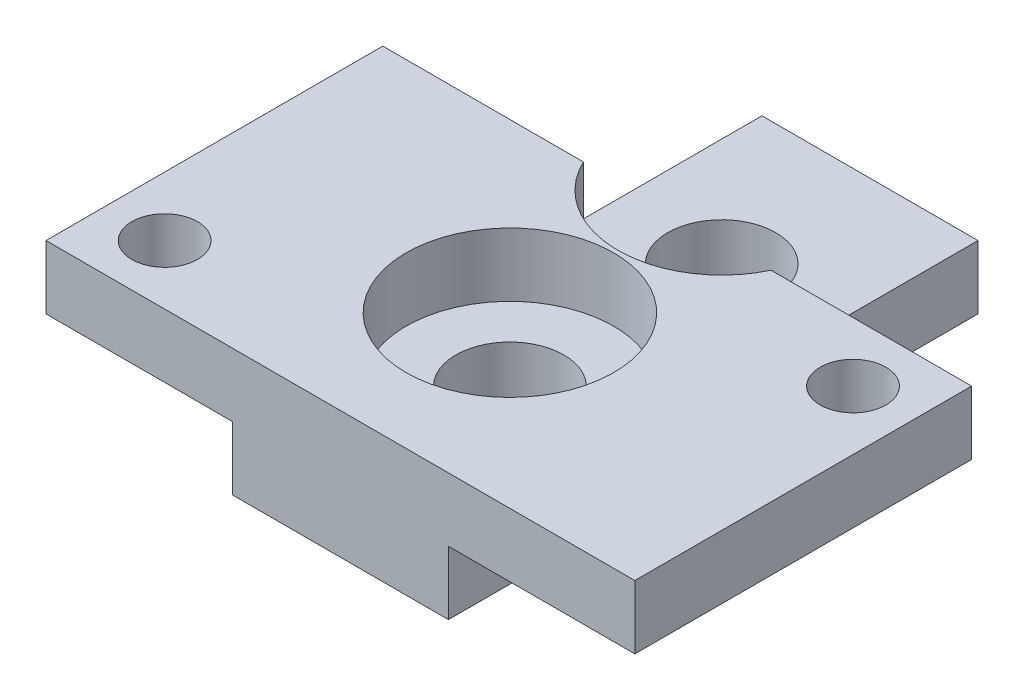
ISO-10303-21;
HEADER;
FILE_DESCRIPTION(('STEP AP214'),'2;1');
FILE_NAME('part.step','',(''),(''),'','','');
FILE_SCHEMA(('AUTOMOTIVE_DESIGN { 1 0 10303 214 1 1 1 1 }'));
ENDSEC;
DATA;
#1=APPLICATION_CONTEXT('core data for automotive mechanical design processes');
#2=APPLICATION_PROTOCOL_DEFINITION('international standard','automotive_design',2000,#1);
#3=PRODUCT_CONTEXT('',#1,'mechanical');
#4=PRODUCT('Part','Part','',(#3));
#5=PRODUCT_RELATED_PRODUCT_CATEGORY('part','',(#4));
#6=PRODUCT_DEFINITION_FORMATION('','',#4);
#7=PRODUCT_DEFINITION_CONTEXT('part definition',#1,'design');
#8=PRODUCT_DEFINITION('design','',#6,#7);
#9=PRODUCT_DEFINITION_SHAPE('','',#8);
#10=(LENGTH_UNIT() NAMED_UNIT(*) SI_UNIT(.MILLI.,.METRE.));
#11=(NAMED_UNIT(*) PLANE_ANGLE_UNIT() SI_UNIT($,.RADIAN.));
#12=(NAMED_UNIT(*) SI_UNIT($,.STERADIAN.) SOLID_ANGLE_UNIT());
#13=UNCERTAINTY_MEASURE_WITH_UNIT(LENGTH_MEASURE(1.E-05),#10,'distance_accuracy_value','');
#14=(GEOMETRIC_REPRESENTATION_CONTEXT(3) GLOBAL_UNCERTAINTY_ASSIGNED_CONTEXT((#13)) GLOBAL_UNIT_ASSIGNED_CONTEXT((#10,
#11,#12)) REPRESENTATION_CONTEXT('',''));
#15=CARTESIAN_POINT('',(0.,0.,0.));
#16=DIRECTION('',(0.,0.,1.));
#17=DIRECTION('',(1.,0.,0.));
#18=AXIS2_PLACEMENT_3D('',#15,#16,#17);
#19=CARTESIAN_POINT('',(0.,3.,-15.9));
#20=DIRECTION('',(0.,0.,1.));
#21=DIRECTION('',(1.,0.,0.));
#22=AXIS2_PLACEMENT_3D('',#19,#20,#21);
#23=PLANE('',#22);
#24=DIRECTION('',(-1.,0.,0.));
#25=VECTOR('',#24,1.);
#26=CARTESIAN_POINT('',(0.,0.,-15.9));
#27=LINE('',#26,#25);
#28=CARTESIAN_POINT('',(19.,0.,-15.9));
#29=VERTEX_POINT('',#28);
#30=CARTESIAN_POINT('',(18.3271887242357,0.,-15.9));
#31=VERTEX_POINT('',#30);
#32=EDGE_CURVE('E147',#29,#31,#27,.T.);
#33=ORIENTED_EDGE('',*,*,#32,.T.);
#34=DIRECTION('',(0.,1.,0.));
#35=VECTOR('',#34,1.);
#36=CARTESIAN_POINT('',(18.3271887242357,0.,-15.9));
#37=LINE('',#36,#35);
#38=CARTESIAN_POINT('',(18.3271887242357,3.,-15.9));
#39=VERTEX_POINT('',#38);
#40=EDGE_CURVE('E128',#31,#39,#37,.T.);
#41=ORIENTED_EDGE('',*,*,#40,.T.);
#42=DIRECTION('',(-1.,0.,0.));
#43=VECTOR('',#42,1.);
#44=CARTESIAN_POINT('',(0.,3.,-15.9));
#45=LINE('',#44,#43);
#46=CARTESIAN_POINT('',(27.8,3.,-15.9));
#47=VERTEX_POINT('',#46);
#48=EDGE_CURVE('E178',#47,#39,#45,.T.);
#49=ORIENTED_EDGE('',*,*,#48,.F.);
#50=DIRECTION('',(0.,-1.,0.));
#51=VECTOR('',#50,1.);
#52=CARTESIAN_POINT('',(27.8,3.,-15.9));
#53=LINE('',#52,#51);
#54=CARTESIAN_POINT('',(27.8,0.,-15.9));
#55=VERTEX_POINT('',#54);
#56=EDGE_CURVE('E198',#47,#55,#53,.T.);
#57=ORIENTED_EDGE('',*,*,#56,.T.);
#58=EDGE_CURVE('E150',#55,#29,#27,.T.);
#59=ORIENTED_EDGE('',*,*,#58,.T.);
#60=EDGE_LOOP('',(#33,#41,#49,#57,#59));
#61=FACE_BOUND('',#60,.T.);
#62=ADVANCED_FACE('F39',(#61),#23,.F.);
#63=CARTESIAN_POINT('',(0.,0.,0.));
#64=DIRECTION('',(0.,-1.,0.));
#65=DIRECTION('',(0.,0.,-1.));
#66=AXIS2_PLACEMENT_3D('',#63,#64,#65);
#67=PLANE('',#66);
#68=DIRECTION('',(0.,0.,-1.));
#69=VECTOR('',#68,1.);
#70=CARTESIAN_POINT('',(8.8,0.,0.));
#71=LINE('',#70,#69);
#72=CARTESIAN_POINT('',(8.8,0.,0.));
#73=VERTEX_POINT('',#72);
#74=CARTESIAN_POINT('',(8.8,0.,-15.9));
#75=VERTEX_POINT('',#74);
#76=EDGE_CURVE('E55',#73,#75,#71,.T.);
#77=ORIENTED_EDGE('',*,*,#76,.F.);
#78=DIRECTION('',(1.,0.,0.));
#79=VECTOR('',#78,1.);
#80=CARTESIAN_POINT('',(0.,0.,0.));
#81=LINE('',#80,#79);
#82=CARTESIAN_POINT('',(0.,0.,0.));
#83=VERTEX_POINT('',#82);
#84=EDGE_CURVE('E189',#83,#73,#81,.T.);
#85=ORIENTED_EDGE('',*,*,#84,.F.);
#86=DIRECTION('',(0.,0.,1.));
#87=VECTOR('',#86,1.);
#88=CARTESIAN_POINT('',(0.,0.,0.));
#89=LINE('',#88,#87);
#90=CARTESIAN_POINT('',(0.,0.,-15.9));
#91=VERTEX_POINT('',#90);
#92=EDGE_CURVE('E183',#91,#83,#89,.T.);
#93=ORIENTED_EDGE('',*,*,#92,.F.);
#94=EDGE_CURVE('E148',#75,#91,#27,.T.);
#95=ORIENTED_EDGE('',*,*,#94,.F.);
#96=EDGE_LOOP('',(#77,#85,#93,#95));
#97=FACE_BOUND('',#96,.T.);
#98=CARTESIAN_POINT('',(2.8,0.,-2.8));
#99=DIRECTION('',(0.,1.,0.));
#100=DIRECTION('',(0.,0.,1.));
#101=AXIS2_PLACEMENT_3D('',#98,#99,#100);
#102=CIRCLE('',#101,1.55);
#103=CARTESIAN_POINT('',(2.8,0.,-1.25));
#104=VERTEX_POINT('',#103);
#105=EDGE_CURVE('E173',#104,#104,#102,.T.);
#106=ORIENTED_EDGE('',*,*,#105,.T.);
#107=EDGE_LOOP('',(#106));
#108=FACE_BOUND('',#107,.T.);
#109=ADVANCED_FACE('F278',(#97,#108),#67,.T.);
#110=CARTESIAN_POINT('',(0.,3.,0.));
#111=DIRECTION('',(0.,-1.,0.));
#112=DIRECTION('',(0.,0.,-1.));
#113=AXIS2_PLACEMENT_3D('',#110,#111,#112);
#114=PLANE('',#113);
#115=CARTESIAN_POINT('',(13.9,3.,-8.));
#116=DIRECTION('',(0.,1.,0.));
#117=DIRECTION('',(0.,0.,1.));
#118=AXIS2_PLACEMENT_3D('',#115,#116,#117);
#119=CIRCLE('',#118,4.9);
#120=CARTESIAN_POINT('',(13.9,3.,-3.1));
#121=VERTEX_POINT('',#120);
#122=EDGE_CURVE('E257',#121,#121,#119,.T.);
#123=ORIENTED_EDGE('',*,*,#122,.F.);
#124=EDGE_LOOP('',(#123));
#125=FACE_BOUND('',#124,.T.);
#126=ORIENTED_EDGE('',*,*,#48,.T.);
#127=CARTESIAN_POINT('',(13.9,3.,-18.));
#128=DIRECTION('',(0.,1.,0.));
#129=DIRECTION('',(0.,0.,1.));
#130=AXIS2_PLACEMENT_3D('',#127,#128,#129);
#131=CIRCLE('',#130,4.9);
#132=CARTESIAN_POINT('',(9.47281127576427,3.,-15.9));
#133=VERTEX_POINT('',#132);
#134=EDGE_CURVE('E133',#133,#39,#131,.T.);
#135=ORIENTED_EDGE('',*,*,#134,.F.);
#136=CARTESIAN_POINT('',(0.,3.,-15.9));
#137=VERTEX_POINT('',#136);
#138=EDGE_CURVE('E138',#133,#137,#45,.T.);
#139=ORIENTED_EDGE('',*,*,#138,.T.);
#140=DIRECTION('',(0.,0.,1.));
#141=VECTOR('',#140,1.);
#142=CARTESIAN_POINT('',(0.,3.,0.));
#143=LINE('',#142,#141);
#144=CARTESIAN_POINT('',(0.,3.,0.));
#145=VERTEX_POINT('',#144);
#146=EDGE_CURVE('E158',#137,#145,#143,.T.);
#147=ORIENTED_EDGE('',*,*,#146,.T.);
#148=DIRECTION('',(1.,0.,0.));
#149=VECTOR('',#148,1.);
#150=CARTESIAN_POINT('',(0.,3.,0.));
#151=LINE('',#150,#149);
#152=CARTESIAN_POINT('',(27.8,3.,0.));
#153=VERTEX_POINT('',#152);
#154=EDGE_CURVE('E164',#145,#153,#151,.T.);
#155=ORIENTED_EDGE('',*,*,#154,.T.);
#156=DIRECTION('',(0.,0.,-1.));
#157=VECTOR('',#156,1.);
#158=CARTESIAN_POINT('',(27.8,3.,0.));
#159=LINE('',#158,#157);
#160=EDGE_CURVE('E170',#153,#47,#159,.T.);
#161=ORIENTED_EDGE('',*,*,#160,.T.);
#162=EDGE_LOOP('',(#126,#135,#139,#147,#155,#161));
#163=FACE_BOUND('',#162,.T.);
#164=CARTESIAN_POINT('',(2.8,3.,-2.8));
#165=DIRECTION('',(0.,1.,0.));
#166=DIRECTION('',(0.,0.,1.));
#167=AXIS2_PLACEMENT_3D('',#164,#165,#166);
#168=CIRCLE('',#167,1.55);
#169=CARTESIAN_POINT('',(2.8,3.,-1.25));
#170=VERTEX_POINT('',#169);
#171=EDGE_CURVE('E188',#170,#170,#168,.T.);
#172=ORIENTED_EDGE('',*,*,#171,.F.);
#173=EDGE_LOOP('',(#172));
#174=FACE_BOUND('',#173,.T.);
#175=CARTESIAN_POINT('',(25.,3.,-13.1));
#176=DIRECTION('',(0.,1.,0.));
#177=DIRECTION('',(0.,0.,1.));
#178=AXIS2_PLACEMENT_3D('',#175,#176,#177);
#179=CIRCLE('',#178,1.55);
#180=CARTESIAN_POINT('',(25.,3.,-11.55));
#181=VERTEX_POINT('',#180);
#182=EDGE_CURVE('E299',#181,#181,#179,.T.);
#183=ORIENTED_EDGE('',*,*,#182,.F.);
#184=EDGE_LOOP('',(#183));
#185=FACE_BOUND('',#184,.T.);
#186=ADVANCED_FACE('F268',(#125,#163,#174,#185),#114,.F.);
#187=DIRECTION('',(0.,0.,1.));
#188=VECTOR('',#187,1.);
#189=CARTESIAN_POINT('',(19.,0.,0.));
#190=LINE('',#189,#188);
#191=CARTESIAN_POINT('',(19.,0.,0.));
#192=VERTEX_POINT('',#191);
#193=EDGE_CURVE('E48',#29,#192,#190,.T.);
#194=ORIENTED_EDGE('',*,*,#193,.F.);
#195=ORIENTED_EDGE('',*,*,#58,.F.);
#196=DIRECTION('',(0.,0.,-1.));
#197=VECTOR('',#196,1.);
#198=CARTESIAN_POINT('',(27.8,0.,0.));
#199=LINE('',#198,#197);
#200=CARTESIAN_POINT('',(27.8,0.,0.));
#201=VERTEX_POINT('',#200);
#202=EDGE_CURVE('E153',#201,#55,#199,.T.);
#203=ORIENTED_EDGE('',*,*,#202,.F.);
#204=EDGE_CURVE('E187',#192,#201,#81,.T.);
#205=ORIENTED_EDGE('',*,*,#204,.F.);
#206=EDGE_LOOP('',(#194,#195,#203,#205));
#207=FACE_BOUND('',#206,.T.);
#208=CARTESIAN_POINT('',(25.,0.,-13.1));
#209=DIRECTION('',(0.,1.,0.));
#210=DIRECTION('',(0.,0.,1.));
#211=AXIS2_PLACEMENT_3D('',#208,#209,#210);
#212=CIRCLE('',#211,1.55);
#213=CARTESIAN_POINT('',(25.,0.,-11.55));
#214=VERTEX_POINT('',#213);
#215=EDGE_CURVE('E298',#214,#214,#212,.T.);
#216=ORIENTED_EDGE('',*,*,#215,.T.);
#217=EDGE_LOOP('',(#216));
#218=FACE_BOUND('',#217,.T.);
#219=ADVANCED_FACE('F205',(#207,#218),#67,.T.);
#220=CARTESIAN_POINT('',(0.,3.,0.));
#221=DIRECTION('',(1.,0.,0.));
#222=DIRECTION('',(0.,0.,-1.));
#223=AXIS2_PLACEMENT_3D('',#220,#221,#222);
#224=PLANE('',#223);
#225=ORIENTED_EDGE('',*,*,#92,.T.);
#226=DIRECTION('',(0.,-1.,0.));
#227=VECTOR('',#226,1.);
#228=CARTESIAN_POINT('',(0.,3.,0.));
#229=LINE('',#228,#227);
#230=EDGE_CURVE('E213',#145,#83,#229,.T.);
#231=ORIENTED_EDGE('',*,*,#230,.F.);
#232=ORIENTED_EDGE('',*,*,#146,.F.);
#233=DIRECTION('',(0.,-1.,0.));
#234=VECTOR('',#233,1.);
#235=CARTESIAN_POINT('',(0.,3.,-15.9));
#236=LINE('',#235,#234);
#237=EDGE_CURVE('E182',#137,#91,#236,.T.);
#238=ORIENTED_EDGE('',*,*,#237,.T.);
#239=EDGE_LOOP('',(#225,#231,#232,#238));
#240=FACE_BOUND('',#239,.T.);
#241=ADVANCED_FACE('F41',(#240),#224,.F.);
#242=CARTESIAN_POINT('',(0.,3.,0.));
#243=DIRECTION('',(0.,0.,-1.));
#244=DIRECTION('',(-1.,0.,0.));
#245=AXIS2_PLACEMENT_3D('',#242,#243,#244);
#246=PLANE('',#245);
#247=ORIENTED_EDGE('',*,*,#84,.T.);
#248=DIRECTION('',(0.,1.,0.));
#249=VECTOR('',#248,1.);
#250=CARTESIAN_POINT('',(8.8,-3.,0.));
#251=LINE('',#250,#249);
#252=CARTESIAN_POINT('',(8.8,-3.,0.));
#253=VERTEX_POINT('',#252);
#254=EDGE_CURVE('E239',#253,#73,#251,.T.);
#255=ORIENTED_EDGE('',*,*,#254,.F.);
#256=DIRECTION('',(-1.,0.,0.));
#257=VECTOR('',#256,1.);
#258=CARTESIAN_POINT('',(8.8,-3.,0.));
#259=LINE('',#258,#257);
#260=CARTESIAN_POINT('',(19.,-3.,0.));
#261=VERTEX_POINT('',#260);
#262=EDGE_CURVE('E236',#261,#253,#259,.T.);
#263=ORIENTED_EDGE('',*,*,#262,.F.);
#264=DIRECTION('',(0.,1.,0.));
#265=VECTOR('',#264,1.);
#266=CARTESIAN_POINT('',(19.,-3.,0.));
#267=LINE('',#266,#265);
#268=EDGE_CURVE('E288',#261,#192,#267,.T.);
#269=ORIENTED_EDGE('',*,*,#268,.T.);
#270=ORIENTED_EDGE('',*,*,#204,.T.);
#271=DIRECTION('',(0.,-1.,0.));
#272=VECTOR('',#271,1.);
#273=CARTESIAN_POINT('',(27.8,3.,0.));
#274=LINE('',#273,#272);
#275=EDGE_CURVE('E201',#153,#201,#274,.T.);
#276=ORIENTED_EDGE('',*,*,#275,.F.);
#277=ORIENTED_EDGE('',*,*,#154,.F.);
#278=ORIENTED_EDGE('',*,*,#230,.T.);
#279=EDGE_LOOP('',(#247,#255,#263,#269,#270,#276,#277,#278));
#280=FACE_BOUND('',#279,.T.);
#281=ADVANCED_FACE('F271',(#280),#246,.F.);
#282=CARTESIAN_POINT('',(27.8,3.,0.));
#283=DIRECTION('',(-1.,0.,0.));
#284=DIRECTION('',(0.,0.,1.));
#285=AXIS2_PLACEMENT_3D('',#282,#283,#284);
#286=PLANE('',#285);
#287=ORIENTED_EDGE('',*,*,#202,.T.);
#288=ORIENTED_EDGE('',*,*,#56,.F.);
#289=ORIENTED_EDGE('',*,*,#160,.F.);
#290=ORIENTED_EDGE('',*,*,#275,.T.);
#291=EDGE_LOOP('',(#287,#288,#289,#290));
#292=FACE_BOUND('',#291,.T.);
#293=ADVANCED_FACE('F196',(#292),#286,.F.);
#294=ORIENTED_EDGE('',*,*,#138,.F.);
#295=DIRECTION('',(0.,1.,0.));
#296=VECTOR('',#295,1.);
#297=CARTESIAN_POINT('',(9.47281127576427,0.,-15.9));
#298=LINE('',#297,#296);
#299=CARTESIAN_POINT('',(9.47281127576427,0.,-15.9));
#300=VERTEX_POINT('',#299);
#301=EDGE_CURVE('E125',#300,#133,#298,.T.);
#302=ORIENTED_EDGE('',*,*,#301,.F.);
#303=EDGE_CURVE('E63',#300,#75,#27,.T.);
#304=ORIENTED_EDGE('',*,*,#303,.T.);
#305=ORIENTED_EDGE('',*,*,#94,.T.);
#306=ORIENTED_EDGE('',*,*,#237,.F.);
#307=EDGE_LOOP('',(#294,#302,#304,#305,#306));
#308=FACE_BOUND('',#307,.T.);
#309=ADVANCED_FACE('F136',(#308),#23,.F.);
#310=CARTESIAN_POINT('',(2.8,3.,-2.8));
#311=DIRECTION('',(0.,-1.,0.));
#312=DIRECTION('',(0.,0.,-1.));
#313=AXIS2_PLACEMENT_3D('',#310,#311,#312);
#314=CYLINDRICAL_SURFACE('',#313,1.55);
#315=ORIENTED_EDGE('',*,*,#171,.T.);
#316=EDGE_LOOP('',(#315));
#317=FACE_BOUND('',#316,.T.);
#318=ORIENTED_EDGE('',*,*,#105,.F.);
#319=EDGE_LOOP('',(#318));
#320=FACE_BOUND('',#319,.T.);
#321=ADVANCED_FACE('F313',(#317,#320),#314,.F.);
#322=CARTESIAN_POINT('',(25.,3.,-13.1));
#323=DIRECTION('',(0.,-1.,0.));
#324=DIRECTION('',(0.,0.,-1.));
#325=AXIS2_PLACEMENT_3D('',#322,#323,#324);
#326=CYLINDRICAL_SURFACE('',#325,1.55);
#327=ORIENTED_EDGE('',*,*,#182,.T.);
#328=EDGE_LOOP('',(#327));
#329=FACE_BOUND('',#328,.T.);
#330=ORIENTED_EDGE('',*,*,#215,.F.);
#331=EDGE_LOOP('',(#330));
#332=FACE_BOUND('',#331,.T.);
#333=ADVANCED_FACE('F315',(#329,#332),#326,.F.);
#334=CARTESIAN_POINT('',(8.8,-3.,0.));
#335=DIRECTION('',(1.,0.,0.));
#336=DIRECTION('',(0.,0.,-1.));
#337=AXIS2_PLACEMENT_3D('',#334,#335,#336);
#338=PLANE('',#337);
#339=ORIENTED_EDGE('',*,*,#76,.T.);
#340=CARTESIAN_POINT('',(8.8,0.,-25.));
#341=VERTEX_POINT('',#340);
#342=EDGE_CURVE('E145',#75,#341,#71,.T.);
#343=ORIENTED_EDGE('',*,*,#342,.T.);
#344=DIRECTION('',(0.,1.,0.));
#345=VECTOR('',#344,1.);
#346=CARTESIAN_POINT('',(8.8,-3.,-25.));
#347=LINE('',#346,#345);
#348=CARTESIAN_POINT('',(8.8,-3.,-25.));
#349=VERTEX_POINT('',#348);
#350=EDGE_CURVE('E295',#349,#341,#347,.T.);
#351=ORIENTED_EDGE('',*,*,#350,.F.);
#352=DIRECTION('',(0.,0.,-1.));
#353=VECTOR('',#352,1.);
#354=CARTESIAN_POINT('',(8.8,-3.,0.));
#355=LINE('',#354,#353);
#356=EDGE_CURVE('E221',#253,#349,#355,.T.);
#357=ORIENTED_EDGE('',*,*,#356,.F.);
#358=ORIENTED_EDGE('',*,*,#254,.T.);
#359=EDGE_LOOP('',(#339,#343,#351,#357,#358));
#360=FACE_BOUND('',#359,.T.);
#361=ADVANCED_FACE('F285',(#360),#338,.F.);
#362=CARTESIAN_POINT('',(8.8,-3.,-25.));
#363=DIRECTION('',(0.,0.,1.));
#364=DIRECTION('',(1.,0.,0.));
#365=AXIS2_PLACEMENT_3D('',#362,#363,#364);
#366=PLANE('',#365);
#367=DIRECTION('',(1.,0.,0.));
#368=VECTOR('',#367,1.);
#369=CARTESIAN_POINT('',(8.8,0.,-25.));
#370=LINE('',#369,#368);
#371=CARTESIAN_POINT('',(19.,0.,-25.));
#372=VERTEX_POINT('',#371);
#373=EDGE_CURVE('E222',#341,#372,#370,.T.);
#374=ORIENTED_EDGE('',*,*,#373,.T.);
#375=DIRECTION('',(0.,1.,0.));
#376=VECTOR('',#375,1.);
#377=CARTESIAN_POINT('',(19.,-3.,-25.));
#378=LINE('',#377,#376);
#379=CARTESIAN_POINT('',(19.,-3.,-25.));
#380=VERTEX_POINT('',#379);
#381=EDGE_CURVE('E290',#380,#372,#378,.T.);
#382=ORIENTED_EDGE('',*,*,#381,.F.);
#383=DIRECTION('',(1.,0.,0.));
#384=VECTOR('',#383,1.);
#385=CARTESIAN_POINT('',(8.8,-3.,-25.));
#386=LINE('',#385,#384);
#387=EDGE_CURVE('E228',#349,#380,#386,.T.);
#388=ORIENTED_EDGE('',*,*,#387,.F.);
#389=ORIENTED_EDGE('',*,*,#350,.T.);
#390=EDGE_LOOP('',(#374,#382,#388,#389));
#391=FACE_BOUND('',#390,.T.);
#392=ADVANCED_FACE('F377',(#391),#366,.F.);
#393=CARTESIAN_POINT('',(19.,-3.,0.));
#394=DIRECTION('',(-1.,0.,0.));
#395=DIRECTION('',(0.,0.,1.));
#396=AXIS2_PLACEMENT_3D('',#393,#394,#395);
#397=PLANE('',#396);
#398=EDGE_CURVE('E215',#372,#29,#190,.T.);
#399=ORIENTED_EDGE('',*,*,#398,.T.);
#400=ORIENTED_EDGE('',*,*,#193,.T.);
#401=ORIENTED_EDGE('',*,*,#268,.F.);
#402=DIRECTION('',(0.,0.,1.));
#403=VECTOR('',#402,1.);
#404=CARTESIAN_POINT('',(19.,-3.,0.));
#405=LINE('',#404,#403);
#406=EDGE_CURVE('E240',#380,#261,#405,.T.);
#407=ORIENTED_EDGE('',*,*,#406,.F.);
#408=ORIENTED_EDGE('',*,*,#381,.T.);
#409=EDGE_LOOP('',(#399,#400,#401,#407,#408));
#410=FACE_BOUND('',#409,.T.);
#411=ADVANCED_FACE('F371',(#410),#397,.F.);
#412=CARTESIAN_POINT('',(0.,-3.,0.));
#413=DIRECTION('',(0.,-1.,0.));
#414=DIRECTION('',(0.,0.,-1.));
#415=AXIS2_PLACEMENT_3D('',#412,#413,#414);
#416=PLANE('',#415);
#417=CARTESIAN_POINT('',(13.9,-3.,-8.));
#418=DIRECTION('',(0.,-1.,0.));
#419=DIRECTION('',(0.,0.,-1.));
#420=AXIS2_PLACEMENT_3D('',#417,#418,#419);
#421=CIRCLE('',#420,2.55);
#422=CARTESIAN_POINT('',(13.9,-3.,-10.55));
#423=VERTEX_POINT('',#422);
#424=EDGE_CURVE('E249',#423,#423,#421,.T.);
#425=ORIENTED_EDGE('',*,*,#424,.F.);
#426=EDGE_LOOP('',(#425));
#427=FACE_BOUND('',#426,.T.);
#428=CARTESIAN_POINT('',(13.9,-3.,-18.));
#429=DIRECTION('',(0.,-1.,0.));
#430=DIRECTION('',(0.,0.,-1.));
#431=AXIS2_PLACEMENT_3D('',#428,#429,#430);
#432=CIRCLE('',#431,2.55);
#433=CARTESIAN_POINT('',(13.9,-3.,-20.55));
#434=VERTEX_POINT('',#433);
#435=EDGE_CURVE('E245',#434,#434,#432,.T.);
#436=ORIENTED_EDGE('',*,*,#435,.F.);
#437=EDGE_LOOP('',(#436));
#438=FACE_BOUND('',#437,.T.);
#439=ORIENTED_EDGE('',*,*,#356,.T.);
#440=ORIENTED_EDGE('',*,*,#387,.T.);
#441=ORIENTED_EDGE('',*,*,#406,.T.);
#442=ORIENTED_EDGE('',*,*,#262,.T.);
#443=EDGE_LOOP('',(#439,#440,#441,#442));
#444=FACE_BOUND('',#443,.T.);
#445=ADVANCED_FACE('F368',(#427,#438,#444),#416,.T.);
#446=CARTESIAN_POINT('',(0.,0.,0.));
#447=DIRECTION('',(0.,-1.,0.));
#448=DIRECTION('',(0.,0.,-1.));
#449=AXIS2_PLACEMENT_3D('',#446,#447,#448);
#450=PLANE('',#449);
#451=ORIENTED_EDGE('',*,*,#303,.F.);
#452=CARTESIAN_POINT('',(13.9,0.,-18.));
#453=DIRECTION('',(0.,1.,0.));
#454=DIRECTION('',(0.,0.,1.));
#455=AXIS2_PLACEMENT_3D('',#452,#453,#454);
#456=CIRCLE('',#455,4.9);
#457=EDGE_CURVE('E123',#300,#31,#456,.T.);
#458=ORIENTED_EDGE('',*,*,#457,.T.);
#459=ORIENTED_EDGE('',*,*,#32,.F.);
#460=ORIENTED_EDGE('',*,*,#398,.F.);
#461=ORIENTED_EDGE('',*,*,#373,.F.);
#462=ORIENTED_EDGE('',*,*,#342,.F.);
#463=EDGE_LOOP('',(#451,#458,#459,#460,#461,#462));
#464=FACE_BOUND('',#463,.T.);
#465=CARTESIAN_POINT('',(13.9,0.,-18.));
#466=DIRECTION('',(0.,-1.,0.));
#467=DIRECTION('',(0.,0.,-1.));
#468=AXIS2_PLACEMENT_3D('',#465,#466,#467);
#469=CIRCLE('',#468,2.55);
#470=CARTESIAN_POINT('',(13.9,0.,-20.55));
#471=VERTEX_POINT('',#470);
#472=EDGE_CURVE('E11',#471,#471,#469,.T.);
#473=ORIENTED_EDGE('',*,*,#472,.T.);
#474=EDGE_LOOP('',(#473));
#475=FACE_BOUND('',#474,.T.);
#476=ADVANCED_FACE('F142',(#464,#475),#450,.F.);
#477=CARTESIAN_POINT('',(13.9,0.,-18.));
#478=DIRECTION('',(0.,-1.,0.));
#479=DIRECTION('',(0.,0.,-1.));
#480=AXIS2_PLACEMENT_3D('',#477,#478,#479);
#481=CYLINDRICAL_SURFACE('',#480,2.55);
#482=ORIENTED_EDGE('',*,*,#472,.F.);
#483=EDGE_LOOP('',(#482));
#484=FACE_BOUND('',#483,.T.);
#485=ORIENTED_EDGE('',*,*,#435,.T.);
#486=EDGE_LOOP('',(#485));
#487=FACE_BOUND('',#486,.T.);
#488=ADVANCED_FACE('F363',(#484,#487),#481,.F.);
#489=CARTESIAN_POINT('',(13.9,0.,-8.));
#490=DIRECTION('',(0.,-1.,0.));
#491=DIRECTION('',(0.,0.,-1.));
#492=AXIS2_PLACEMENT_3D('',#489,#490,#491);
#493=CYLINDRICAL_SURFACE('',#492,2.55);
#494=CARTESIAN_POINT('',(13.9,0.,-8.));
#495=DIRECTION('',(0.,-1.,0.));
#496=DIRECTION('',(0.,0.,-1.));
#497=AXIS2_PLACEMENT_3D('',#494,#495,#496);
#498=CIRCLE('',#497,2.55);
#499=CARTESIAN_POINT('',(13.9,0.,-10.55));
#500=VERTEX_POINT('',#499);
#501=EDGE_CURVE('E250',#500,#500,#498,.T.);
#502=ORIENTED_EDGE('',*,*,#501,.F.);
#503=EDGE_LOOP('',(#502));
#504=FACE_BOUND('',#503,.T.);
#505=ORIENTED_EDGE('',*,*,#424,.T.);
#506=EDGE_LOOP('',(#505));
#507=FACE_BOUND('',#506,.T.);
#508=ADVANCED_FACE('F360',(#504,#507),#493,.F.);
#509=CARTESIAN_POINT('',(13.9,0.,-18.));
#510=DIRECTION('',(0.,1.,0.));
#511=DIRECTION('',(0.,0.,1.));
#512=AXIS2_PLACEMENT_3D('',#509,#510,#511);
#513=CYLINDRICAL_SURFACE('',#512,4.9);
#514=ORIENTED_EDGE('',*,*,#134,.T.);
#515=ORIENTED_EDGE('',*,*,#40,.F.);
#516=ORIENTED_EDGE('',*,*,#457,.F.);
#517=ORIENTED_EDGE('',*,*,#301,.T.);
#518=EDGE_LOOP('',(#514,#515,#516,#517));
#519=FACE_BOUND('',#518,.T.);
#520=ADVANCED_FACE('F124',(#519),#513,.F.);
#521=CARTESIAN_POINT('',(0.,0.,0.));
#522=DIRECTION('',(0.,1.,0.));
#523=DIRECTION('',(0.,0.,1.));
#524=AXIS2_PLACEMENT_3D('',#521,#522,#523);
#525=PLANE('',#524);
#526=CARTESIAN_POINT('',(13.9,0.,-8.));
#527=DIRECTION('',(0.,1.,0.));
#528=DIRECTION('',(0.,0.,1.));
#529=AXIS2_PLACEMENT_3D('',#526,#527,#528);
#530=CIRCLE('',#529,4.9);
#531=CARTESIAN_POINT('',(13.9,0.,-3.1));
#532=VERTEX_POINT('',#531);
#533=EDGE_CURVE('E261',#532,#532,#530,.T.);
#534=ORIENTED_EDGE('',*,*,#533,.T.);
#535=EDGE_LOOP('',(#534));
#536=FACE_BOUND('',#535,.T.);
#537=ORIENTED_EDGE('',*,*,#501,.T.);
#538=EDGE_LOOP('',(#537));
#539=FACE_BOUND('',#538,.T.);
#540=ADVANCED_FACE('F349',(#536,#539),#525,.T.);
#541=CARTESIAN_POINT('',(13.9,0.,-8.));
#542=DIRECTION('',(0.,1.,0.));
#543=DIRECTION('',(0.,0.,1.));
#544=AXIS2_PLACEMENT_3D('',#541,#542,#543);
#545=CYLINDRICAL_SURFACE('',#544,4.9);
#546=ORIENTED_EDGE('',*,*,#533,.F.);
#547=EDGE_LOOP('',(#546));
#548=FACE_BOUND('',#547,.T.);
#549=ORIENTED_EDGE('',*,*,#122,.T.);
#550=EDGE_LOOP('',(#549));
#551=FACE_BOUND('',#550,.T.);
#552=ADVANCED_FACE('F347',(#548,#551),#545,.F.);
#553=CLOSED_SHELL('',(#62,#109,#186,#219,#241,#281,#293,#309,#321,#333,#361,#392,#411,#445,#476,
#488,#508,#520,#540,#552));
#554=MANIFOLD_SOLID_BREP('B2',#553);
#555=ADVANCED_BREP_SHAPE_REPRESENTATION('',(#18,#554),#14);
#556=SHAPE_DEFINITION_REPRESENTATION(#9,#555);
ENDSEC;
END-ISO-10303-21;
